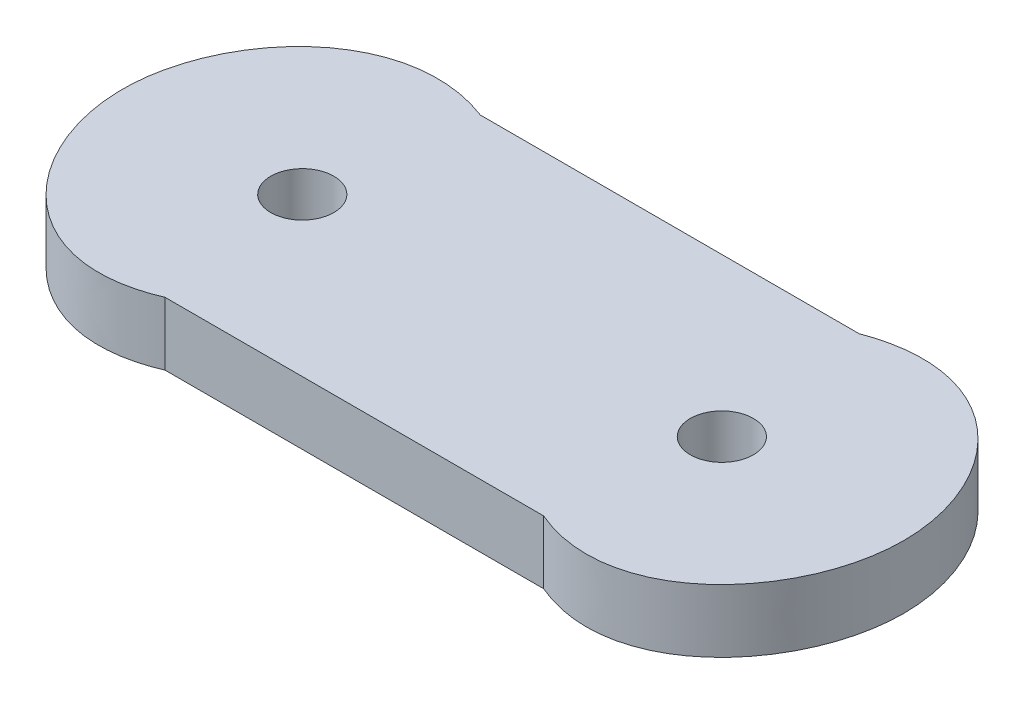
ISO-10303-21;
HEADER;
FILE_DESCRIPTION(('STEP AP214'),'2;1');
FILE_NAME('part.step','',(''),(''),'','','');
FILE_SCHEMA(('AUTOMOTIVE_DESIGN { 1 0 10303 214 1 1 1 1 }'));
ENDSEC;
DATA;
#1=APPLICATION_CONTEXT('core data for automotive mechanical design processes');
#2=APPLICATION_PROTOCOL_DEFINITION('international standard','automotive_design',2000,#1);
#3=PRODUCT_CONTEXT('',#1,'mechanical');
#4=PRODUCT('Part','Part','',(#3));
#5=PRODUCT_RELATED_PRODUCT_CATEGORY('part','',(#4));
#6=PRODUCT_DEFINITION_FORMATION('','',#4);
#7=PRODUCT_DEFINITION_CONTEXT('part definition',#1,'design');
#8=PRODUCT_DEFINITION('design','',#6,#7);
#9=PRODUCT_DEFINITION_SHAPE('','',#8);
#10=(LENGTH_UNIT() NAMED_UNIT(*) SI_UNIT(.MILLI.,.METRE.));
#11=(NAMED_UNIT(*) PLANE_ANGLE_UNIT() SI_UNIT($,.RADIAN.));
#12=(NAMED_UNIT(*) SI_UNIT($,.STERADIAN.) SOLID_ANGLE_UNIT());
#13=UNCERTAINTY_MEASURE_WITH_UNIT(LENGTH_MEASURE(1.E-05),#10,'distance_accuracy_value','');
#14=(GEOMETRIC_REPRESENTATION_CONTEXT(3) GLOBAL_UNCERTAINTY_ASSIGNED_CONTEXT((#13)) GLOBAL_UNIT_ASSIGNED_CONTEXT((#10,
#11,#12)) REPRESENTATION_CONTEXT('',''));
#15=CARTESIAN_POINT('',(0.,0.,0.));
#16=DIRECTION('',(0.,0.,1.));
#17=DIRECTION('',(1.,0.,0.));
#18=AXIS2_PLACEMENT_3D('',#15,#16,#17);
#19=CARTESIAN_POINT('',(18.5797186885291,3.,0.0290040914402249));
#20=DIRECTION('',(0.,1.,0.));
#21=DIRECTION('',(0.,0.,1.));
#22=AXIS2_PLACEMENT_3D('',#19,#20,#21);
#23=PLANE('',#22);
#24=CARTESIAN_POINT('',(-9.97375958311172,3.,0.));
#25=DIRECTION('',(0.,1.,0.));
#26=DIRECTION('',(0.,0.,1.));
#27=AXIS2_PLACEMENT_3D('',#24,#25,#26);
#28=CIRCLE('',#27,1.5);
#29=CARTESIAN_POINT('',(-9.97375958311172,3.,1.5));
#30=VERTEX_POINT('',#29);
#31=EDGE_CURVE('E143',#30,#30,#28,.T.);
#32=ORIENTED_EDGE('',*,*,#31,.F.);
#33=EDGE_LOOP('',(#32));
#34=FACE_BOUND('',#33,.T.);
#35=CARTESIAN_POINT('',(9.,3.,7.5));
#36=CARTESIAN_POINT('',(14.2224649766616,3.,9.74400485042129));
#37=CARTESIAN_POINT('',(22.8640462936803,3.,-0.0629929998970627));
#38=CARTESIAN_POINT('',(14.3686792027879,3.,-9.54067577632157));
#39=CARTESIAN_POINT('',(9.,3.,-7.5));
#40=B_SPLINE_CURVE_WITH_KNOTS('',3,(#35,#36,#37,#38,#39),.UNSPECIFIED.,.F.,.F.,(4,1,4),(0.,
0.501002666314479,1.),.UNSPECIFIED.);
#41=CARTESIAN_POINT('',(9.,3.,7.5));
#42=VERTEX_POINT('',#41);
#43=CARTESIAN_POINT('',(9.,3.,-7.5));
#44=VERTEX_POINT('',#43);
#45=EDGE_CURVE('E85',#42,#44,#40,.T.);
#46=ORIENTED_EDGE('',*,*,#45,.T.);
#47=DIRECTION('',(-1.,0.,0.));
#48=VECTOR('',#47,1.);
#49=CARTESIAN_POINT('',(9.,3.,-7.5));
#50=LINE('',#49,#48);
#51=CARTESIAN_POINT('',(-9.,3.,-7.5));
#52=VERTEX_POINT('',#51);
#53=EDGE_CURVE('E80',#44,#52,#50,.T.);
#54=ORIENTED_EDGE('',*,*,#53,.T.);
#55=CARTESIAN_POINT('',(-9.,3.,-7.5));
#56=CARTESIAN_POINT('',(-14.3686792027879,3.,-9.54067577632157));
#57=CARTESIAN_POINT('',(-22.8640462936803,3.,-0.0629929998970626));
#58=CARTESIAN_POINT('',(-14.2224649766616,3.,9.74400485042129));
#59=CARTESIAN_POINT('',(-9.,3.,7.5));
#60=B_SPLINE_CURVE_WITH_KNOTS('',3,(#55,#56,#57,#58,#59),.UNSPECIFIED.,.F.,.F.,(4,1,4),(0.,
0.498997333685521,1.),.UNSPECIFIED.);
#61=CARTESIAN_POINT('',(-9.,3.,7.5));
#62=VERTEX_POINT('',#61);
#63=EDGE_CURVE('E83',#52,#62,#60,.T.);
#64=ORIENTED_EDGE('',*,*,#63,.T.);
#65=DIRECTION('',(1.,0.,0.));
#66=VECTOR('',#65,1.);
#67=CARTESIAN_POINT('',(9.,3.,7.5));
#68=LINE('',#67,#66);
#69=EDGE_CURVE('E50',#62,#42,#68,.T.);
#70=ORIENTED_EDGE('',*,*,#69,.T.);
#71=EDGE_LOOP('',(#46,#54,#64,#70));
#72=FACE_BOUND('',#71,.T.);
#73=CARTESIAN_POINT('',(9.97375958311172,3.,0.));
#74=DIRECTION('',(0.,1.,0.));
#75=DIRECTION('',(0.,0.,-1.));
#76=AXIS2_PLACEMENT_3D('',#73,#74,#75);
#77=CIRCLE('',#76,1.5);
#78=CARTESIAN_POINT('',(9.97375958311172,3.,-1.5));
#79=VERTEX_POINT('',#78);
#80=EDGE_CURVE('E134',#79,#79,#77,.T.);
#81=ORIENTED_EDGE('',*,*,#80,.F.);
#82=EDGE_LOOP('',(#81));
#83=FACE_BOUND('',#82,.T.);
#84=ADVANCED_FACE('F32',(#34,#72,#83),#23,.T.);
#85=CARTESIAN_POINT('',(18.5797186885291,0.,0.0290040914402249));
#86=DIRECTION('',(0.,1.,0.));
#87=DIRECTION('',(0.,0.,1.));
#88=AXIS2_PLACEMENT_3D('',#85,#86,#87);
#89=PLANE('',#88);
#90=CARTESIAN_POINT('',(9.,0.,7.5));
#91=CARTESIAN_POINT('',(14.2224649766616,0.,9.74400485042129));
#92=CARTESIAN_POINT('',(22.8640462936803,0.,-0.0629929998970627));
#93=CARTESIAN_POINT('',(14.3686792027879,0.,-9.54067577632157));
#94=CARTESIAN_POINT('',(9.,0.,-7.5));
#95=B_SPLINE_CURVE_WITH_KNOTS('',3,(#90,#91,#92,#93,#94),.UNSPECIFIED.,.F.,.F.,(4,1,4),(0.,
0.501002666314479,1.),.UNSPECIFIED.);
#96=CARTESIAN_POINT('',(9.,0.,7.5));
#97=VERTEX_POINT('',#96);
#98=CARTESIAN_POINT('',(9.,0.,-7.5));
#99=VERTEX_POINT('',#98);
#100=EDGE_CURVE('E146',#97,#99,#95,.T.);
#101=ORIENTED_EDGE('',*,*,#100,.F.);
#102=DIRECTION('',(1.,0.,0.));
#103=VECTOR('',#102,1.);
#104=CARTESIAN_POINT('',(9.,0.,7.5));
#105=LINE('',#104,#103);
#106=CARTESIAN_POINT('',(-9.,0.,7.5));
#107=VERTEX_POINT('',#106);
#108=EDGE_CURVE('E73',#107,#97,#105,.T.);
#109=ORIENTED_EDGE('',*,*,#108,.F.);
#110=CARTESIAN_POINT('',(-9.,0.,-7.5));
#111=CARTESIAN_POINT('',(-14.3686792027879,0.,-9.54067577632157));
#112=CARTESIAN_POINT('',(-22.8640462936803,0.,-0.0629929998970626));
#113=CARTESIAN_POINT('',(-14.2224649766616,0.,9.74400485042129));
#114=CARTESIAN_POINT('',(-9.,0.,7.5));
#115=B_SPLINE_CURVE_WITH_KNOTS('',3,(#110,#111,#112,#113,#114),.UNSPECIFIED.,.F.,.F.,(4,1,4),
(0.,0.498997333685521,1.),.UNSPECIFIED.);
#116=CARTESIAN_POINT('',(-9.,0.,-7.5));
#117=VERTEX_POINT('',#116);
#118=EDGE_CURVE('E67',#117,#107,#115,.T.);
#119=ORIENTED_EDGE('',*,*,#118,.F.);
#120=DIRECTION('',(-1.,0.,0.));
#121=VECTOR('',#120,1.);
#122=CARTESIAN_POINT('',(9.,0.,-7.5));
#123=LINE('',#122,#121);
#124=EDGE_CURVE('E89',#99,#117,#123,.T.);
#125=ORIENTED_EDGE('',*,*,#124,.F.);
#126=EDGE_LOOP('',(#101,#109,#119,#125));
#127=FACE_BOUND('',#126,.T.);
#128=CARTESIAN_POINT('',(-9.97375958311172,0.,0.));
#129=DIRECTION('',(0.,1.,0.));
#130=DIRECTION('',(0.,0.,1.));
#131=AXIS2_PLACEMENT_3D('',#128,#129,#130);
#132=CIRCLE('',#131,1.5);
#133=CARTESIAN_POINT('',(-9.97375958311172,0.,1.5));
#134=VERTEX_POINT('',#133);
#135=EDGE_CURVE('E140',#134,#134,#132,.T.);
#136=ORIENTED_EDGE('',*,*,#135,.T.);
#137=EDGE_LOOP('',(#136));
#138=FACE_BOUND('',#137,.T.);
#139=CARTESIAN_POINT('',(9.97375958311172,0.,0.));
#140=DIRECTION('',(0.,1.,0.));
#141=DIRECTION('',(0.,0.,-1.));
#142=AXIS2_PLACEMENT_3D('',#139,#140,#141);
#143=CIRCLE('',#142,1.5);
#144=CARTESIAN_POINT('',(9.97375958311172,0.,-1.5));
#145=VERTEX_POINT('',#144);
#146=EDGE_CURVE('E137',#145,#145,#143,.T.);
#147=ORIENTED_EDGE('',*,*,#146,.T.);
#148=EDGE_LOOP('',(#147));
#149=FACE_BOUND('',#148,.T.);
#150=ADVANCED_FACE('F111',(#127,#138,#149),#89,.F.);
#151=DIRECTION('',(0.,-1.,0.));
#152=VECTOR('',#151,1.);
#153=SURFACE_OF_LINEAR_EXTRUSION('',#40,#152);
#154=ORIENTED_EDGE('',*,*,#100,.T.);
#155=DIRECTION('',(0.,-1.,0.));
#156=VECTOR('',#155,1.);
#157=CARTESIAN_POINT('',(9.,3.,-7.5));
#158=LINE('',#157,#156);
#159=EDGE_CURVE('E11',#44,#99,#158,.T.);
#160=ORIENTED_EDGE('',*,*,#159,.F.);
#161=ORIENTED_EDGE('',*,*,#45,.F.);
#162=DIRECTION('',(0.,-1.,0.));
#163=VECTOR('',#162,1.);
#164=CARTESIAN_POINT('',(9.,3.,7.5));
#165=LINE('',#164,#163);
#166=EDGE_CURVE('E93',#42,#97,#165,.T.);
#167=ORIENTED_EDGE('',*,*,#166,.T.);
#168=EDGE_LOOP('',(#154,#160,#161,#167));
#169=FACE_BOUND('',#168,.T.);
#170=ADVANCED_FACE('F34',(#169),#153,.F.);
#171=CARTESIAN_POINT('',(9.,3.,-7.5));
#172=DIRECTION('',(0.,0.,1.));
#173=DIRECTION('',(1.,0.,0.));
#174=AXIS2_PLACEMENT_3D('',#171,#172,#173);
#175=PLANE('',#174);
#176=ORIENTED_EDGE('',*,*,#124,.T.);
#177=DIRECTION('',(0.,-1.,0.));
#178=VECTOR('',#177,1.);
#179=CARTESIAN_POINT('',(-9.,3.,-7.5));
#180=LINE('',#179,#178);
#181=EDGE_CURVE('E42',#52,#117,#180,.T.);
#182=ORIENTED_EDGE('',*,*,#181,.F.);
#183=ORIENTED_EDGE('',*,*,#53,.F.);
#184=ORIENTED_EDGE('',*,*,#159,.T.);
#185=EDGE_LOOP('',(#176,#182,#183,#184));
#186=FACE_BOUND('',#185,.T.);
#187=ADVANCED_FACE('F88',(#186),#175,.F.);
#188=DIRECTION('',(0.,-1.,0.));
#189=VECTOR('',#188,1.);
#190=SURFACE_OF_LINEAR_EXTRUSION('',#60,#189);
#191=ORIENTED_EDGE('',*,*,#118,.T.);
#192=DIRECTION('',(0.,-1.,0.));
#193=VECTOR('',#192,1.);
#194=CARTESIAN_POINT('',(-9.,3.,7.5));
#195=LINE('',#194,#193);
#196=EDGE_CURVE('E90',#62,#107,#195,.T.);
#197=ORIENTED_EDGE('',*,*,#196,.F.);
#198=ORIENTED_EDGE('',*,*,#63,.F.);
#199=ORIENTED_EDGE('',*,*,#181,.T.);
#200=EDGE_LOOP('',(#191,#197,#198,#199));
#201=FACE_BOUND('',#200,.T.);
#202=ADVANCED_FACE('F91',(#201),#190,.F.);
#203=CARTESIAN_POINT('',(9.,3.,7.5));
#204=DIRECTION('',(0.,0.,-1.));
#205=DIRECTION('',(-1.,0.,0.));
#206=AXIS2_PLACEMENT_3D('',#203,#204,#205);
#207=PLANE('',#206);
#208=ORIENTED_EDGE('',*,*,#108,.T.);
#209=ORIENTED_EDGE('',*,*,#166,.F.);
#210=ORIENTED_EDGE('',*,*,#69,.F.);
#211=ORIENTED_EDGE('',*,*,#196,.T.);
#212=EDGE_LOOP('',(#208,#209,#210,#211));
#213=FACE_BOUND('',#212,.T.);
#214=ADVANCED_FACE('F105',(#213),#207,.F.);
#215=CARTESIAN_POINT('',(-9.97375958311172,3.,0.));
#216=DIRECTION('',(0.,-1.,0.));
#217=DIRECTION('',(0.,0.,-1.));
#218=AXIS2_PLACEMENT_3D('',#215,#216,#217);
#219=CYLINDRICAL_SURFACE('',#218,1.5);
#220=ORIENTED_EDGE('',*,*,#31,.T.);
#221=EDGE_LOOP('',(#220));
#222=FACE_BOUND('',#221,.T.);
#223=ORIENTED_EDGE('',*,*,#135,.F.);
#224=EDGE_LOOP('',(#223));
#225=FACE_BOUND('',#224,.T.);
#226=ADVANCED_FACE('F122',(#222,#225),#219,.F.);
#227=CARTESIAN_POINT('',(9.97375958311172,3.,0.));
#228=DIRECTION('',(0.,-1.,0.));
#229=DIRECTION('',(0.,0.,-1.));
#230=AXIS2_PLACEMENT_3D('',#227,#228,#229);
#231=CYLINDRICAL_SURFACE('',#230,1.5);
#232=ORIENTED_EDGE('',*,*,#80,.T.);
#233=EDGE_LOOP('',(#232));
#234=FACE_BOUND('',#233,.T.);
#235=ORIENTED_EDGE('',*,*,#146,.F.);
#236=EDGE_LOOP('',(#235));
#237=FACE_BOUND('',#236,.T.);
#238=ADVANCED_FACE('F125',(#234,#237),#231,.F.);
#239=CLOSED_SHELL('',(#84,#150,#170,#187,#202,#214,#226,#238));
#240=MANIFOLD_SOLID_BREP('B2',#239);
#241=ADVANCED_BREP_SHAPE_REPRESENTATION('',(#18,#240),#14);
#242=SHAPE_DEFINITION_REPRESENTATION(#9,#241);
ENDSEC;
END-ISO-10303-21;
